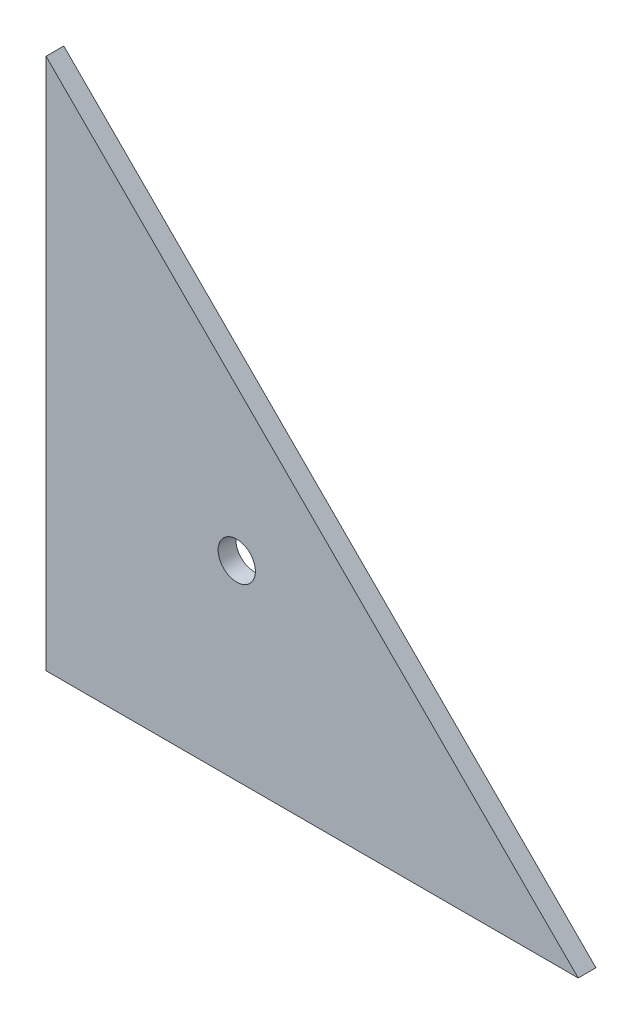
ISO-10303-21;
HEADER;
FILE_DESCRIPTION(('STEP AP214'),'2;1');
FILE_NAME('part.step','',(''),(''),'','','');
FILE_SCHEMA(('AUTOMOTIVE_DESIGN { 1 0 10303 214 1 1 1 1 }'));
ENDSEC;
DATA;
#1=APPLICATION_CONTEXT('core data for automotive mechanical design processes');
#2=APPLICATION_PROTOCOL_DEFINITION('international standard','automotive_design',2000,#1);
#3=PRODUCT_CONTEXT('',#1,'mechanical');
#4=PRODUCT('Part','Part','',(#3));
#5=PRODUCT_RELATED_PRODUCT_CATEGORY('part','',(#4));
#6=PRODUCT_DEFINITION_FORMATION('','',#4);
#7=PRODUCT_DEFINITION_CONTEXT('part definition',#1,'design');
#8=PRODUCT_DEFINITION('design','',#6,#7);
#9=PRODUCT_DEFINITION_SHAPE('','',#8);
#10=(LENGTH_UNIT() NAMED_UNIT(*) SI_UNIT(.MILLI.,.METRE.));
#11=(NAMED_UNIT(*) PLANE_ANGLE_UNIT() SI_UNIT($,.RADIAN.));
#12=(NAMED_UNIT(*) SI_UNIT($,.STERADIAN.) SOLID_ANGLE_UNIT());
#13=UNCERTAINTY_MEASURE_WITH_UNIT(LENGTH_MEASURE(1.E-05),#10,'distance_accuracy_value','');
#14=(GEOMETRIC_REPRESENTATION_CONTEXT(3) GLOBAL_UNCERTAINTY_ASSIGNED_CONTEXT((#13)) GLOBAL_UNIT_ASSIGNED_CONTEXT((#10,
#11,#12)) REPRESENTATION_CONTEXT('',''));
#15=CARTESIAN_POINT('',(0.,0.,0.));
#16=DIRECTION('',(0.,0.,1.));
#17=DIRECTION('',(1.,0.,0.));
#18=AXIS2_PLACEMENT_3D('',#15,#16,#17);
#19=CARTESIAN_POINT('',(60.,0.,-2.));
#20=DIRECTION('',(0.,-1.,0.));
#21=DIRECTION('',(1.,0.,0.));
#22=AXIS2_PLACEMENT_3D('',#19,#20,#21);
#23=PLANE('',#22);
#24=DIRECTION('',(1.,0.,0.));
#25=VECTOR('',#24,1.);
#26=CARTESIAN_POINT('',(60.,0.,0.));
#27=LINE('',#26,#25);
#28=CARTESIAN_POINT('',(0.,0.,0.));
#29=VERTEX_POINT('',#28);
#30=CARTESIAN_POINT('',(60.,0.,0.));
#31=VERTEX_POINT('',#30);
#32=EDGE_CURVE('E101',#29,#31,#27,.T.);
#33=ORIENTED_EDGE('',*,*,#32,.F.);
#34=DIRECTION('',(0.,0.,1.));
#35=VECTOR('',#34,1.);
#36=CARTESIAN_POINT('',(0.,0.,-2.));
#37=LINE('',#36,#35);
#38=CARTESIAN_POINT('',(0.,0.,-2.));
#39=VERTEX_POINT('',#38);
#40=EDGE_CURVE('E11',#39,#29,#37,.T.);
#41=ORIENTED_EDGE('',*,*,#40,.F.);
#42=DIRECTION('',(1.,0.,0.));
#43=VECTOR('',#42,1.);
#44=CARTESIAN_POINT('',(60.,0.,-2.));
#45=LINE('',#44,#43);
#46=CARTESIAN_POINT('',(60.,0.,-2.));
#47=VERTEX_POINT('',#46);
#48=EDGE_CURVE('E90',#39,#47,#45,.T.);
#49=ORIENTED_EDGE('',*,*,#48,.T.);
#50=DIRECTION('',(0.,0.,1.));
#51=VECTOR('',#50,1.);
#52=CARTESIAN_POINT('',(60.,0.,-2.));
#53=LINE('',#52,#51);
#54=EDGE_CURVE('E43',#47,#31,#53,.T.);
#55=ORIENTED_EDGE('',*,*,#54,.T.);
#56=EDGE_LOOP('',(#33,#41,#49,#55));
#57=FACE_BOUND('',#56,.T.);
#58=ADVANCED_FACE('F40',(#57),#23,.T.);
#59=CARTESIAN_POINT('',(0.,0.,-2.));
#60=DIRECTION('',(-1.,0.,0.));
#61=DIRECTION('',(0.,0.,1.));
#62=AXIS2_PLACEMENT_3D('',#59,#60,#61);
#63=PLANE('',#62);
#64=DIRECTION('',(0.,-1.,0.));
#65=VECTOR('',#64,1.);
#66=CARTESIAN_POINT('',(0.,0.,0.));
#67=LINE('',#66,#65);
#68=CARTESIAN_POINT('',(0.,60.,0.));
#69=VERTEX_POINT('',#68);
#70=EDGE_CURVE('E92',#69,#29,#67,.T.);
#71=ORIENTED_EDGE('',*,*,#70,.F.);
#72=DIRECTION('',(0.,0.,1.));
#73=VECTOR('',#72,1.);
#74=CARTESIAN_POINT('',(0.,60.,-2.));
#75=LINE('',#74,#73);
#76=CARTESIAN_POINT('',(0.,60.,-2.));
#77=VERTEX_POINT('',#76);
#78=EDGE_CURVE('E49',#77,#69,#75,.T.);
#79=ORIENTED_EDGE('',*,*,#78,.F.);
#80=DIRECTION('',(0.,-1.,0.));
#81=VECTOR('',#80,1.);
#82=CARTESIAN_POINT('',(0.,0.,-2.));
#83=LINE('',#82,#81);
#84=EDGE_CURVE('E87',#77,#39,#83,.T.);
#85=ORIENTED_EDGE('',*,*,#84,.T.);
#86=ORIENTED_EDGE('',*,*,#40,.T.);
#87=EDGE_LOOP('',(#71,#79,#85,#86));
#88=FACE_BOUND('',#87,.T.);
#89=ADVANCED_FACE('F106',(#88),#63,.T.);
#90=CARTESIAN_POINT('',(0.,60.,-2.));
#91=DIRECTION('',(0.707106781186547,0.707106781186547,0.));
#92=DIRECTION('',(-0.707106781186548,0.707106781186548,0.));
#93=AXIS2_PLACEMENT_3D('',#90,#91,#92);
#94=PLANE('',#93);
#95=DIRECTION('',(-0.707106781186547,0.707106781186547,0.));
#96=VECTOR('',#95,1.);
#97=CARTESIAN_POINT('',(0.,60.,0.));
#98=LINE('',#97,#96);
#99=EDGE_CURVE('E85',#31,#69,#98,.T.);
#100=ORIENTED_EDGE('',*,*,#99,.F.);
#101=ORIENTED_EDGE('',*,*,#54,.F.);
#102=DIRECTION('',(-0.707106781186547,0.707106781186547,0.));
#103=VECTOR('',#102,1.);
#104=CARTESIAN_POINT('',(0.,60.,-2.));
#105=LINE('',#104,#103);
#106=EDGE_CURVE('E83',#47,#77,#105,.T.);
#107=ORIENTED_EDGE('',*,*,#106,.T.);
#108=ORIENTED_EDGE('',*,*,#78,.T.);
#109=EDGE_LOOP('',(#100,#101,#107,#108));
#110=FACE_BOUND('',#109,.T.);
#111=ADVANCED_FACE('F82',(#110),#94,.T.);
#112=CARTESIAN_POINT('',(0.,0.,-2.));
#113=DIRECTION('',(0.,0.,-1.));
#114=DIRECTION('',(-1.,0.,0.));
#115=AXIS2_PLACEMENT_3D('',#112,#113,#114);
#116=PLANE('',#115);
#117=CARTESIAN_POINT('',(21.5,21.5,-2.));
#118=DIRECTION('',(0.,0.,1.));
#119=DIRECTION('',(1.,0.,0.));
#120=AXIS2_PLACEMENT_3D('',#117,#118,#119);
#121=CIRCLE('',#120,2.1);
#122=CARTESIAN_POINT('',(23.6,21.5,-2.));
#123=VERTEX_POINT('',#122);
#124=EDGE_CURVE('E103',#123,#123,#121,.T.);
#125=ORIENTED_EDGE('',*,*,#124,.T.);
#126=EDGE_LOOP('',(#125));
#127=FACE_BOUND('',#126,.T.);
#128=ORIENTED_EDGE('',*,*,#48,.F.);
#129=ORIENTED_EDGE('',*,*,#84,.F.);
#130=ORIENTED_EDGE('',*,*,#106,.F.);
#131=EDGE_LOOP('',(#128,#129,#130));
#132=FACE_BOUND('',#131,.T.);
#133=ADVANCED_FACE('F89',(#127,#132),#116,.T.);
#134=CARTESIAN_POINT('',(0.,0.,0.));
#135=DIRECTION('',(0.,0.,-1.));
#136=DIRECTION('',(-1.,0.,0.));
#137=AXIS2_PLACEMENT_3D('',#134,#135,#136);
#138=PLANE('',#137);
#139=CARTESIAN_POINT('',(21.5,21.5,0.));
#140=DIRECTION('',(0.,0.,1.));
#141=DIRECTION('',(1.,0.,0.));
#142=AXIS2_PLACEMENT_3D('',#139,#140,#141);
#143=CIRCLE('',#142,2.1);
#144=CARTESIAN_POINT('',(23.6,21.5,0.));
#145=VERTEX_POINT('',#144);
#146=EDGE_CURVE('E97',#145,#145,#143,.T.);
#147=ORIENTED_EDGE('',*,*,#146,.F.);
#148=EDGE_LOOP('',(#147));
#149=FACE_BOUND('',#148,.T.);
#150=ORIENTED_EDGE('',*,*,#32,.T.);
#151=ORIENTED_EDGE('',*,*,#99,.T.);
#152=ORIENTED_EDGE('',*,*,#70,.T.);
#153=EDGE_LOOP('',(#150,#151,#152));
#154=FACE_BOUND('',#153,.T.);
#155=ADVANCED_FACE('F105',(#149,#154),#138,.F.);
#156=CARTESIAN_POINT('',(21.5,21.5,-2.));
#157=DIRECTION('',(0.,0.,1.));
#158=DIRECTION('',(1.,0.,0.));
#159=AXIS2_PLACEMENT_3D('',#156,#157,#158);
#160=CYLINDRICAL_SURFACE('',#159,2.1);
#161=ORIENTED_EDGE('',*,*,#124,.F.);
#162=EDGE_LOOP('',(#161));
#163=FACE_BOUND('',#162,.T.);
#164=ORIENTED_EDGE('',*,*,#146,.T.);
#165=EDGE_LOOP('',(#164));
#166=FACE_BOUND('',#165,.T.);
#167=ADVANCED_FACE('F116',(#163,#166),#160,.F.);
#168=CLOSED_SHELL('',(#58,#89,#111,#133,#155,#167));
#169=MANIFOLD_SOLID_BREP('B2',#168);
#170=ADVANCED_BREP_SHAPE_REPRESENTATION('',(#18,#169),#14);
#171=SHAPE_DEFINITION_REPRESENTATION(#9,#170);
ENDSEC;
END-ISO-10303-21;
